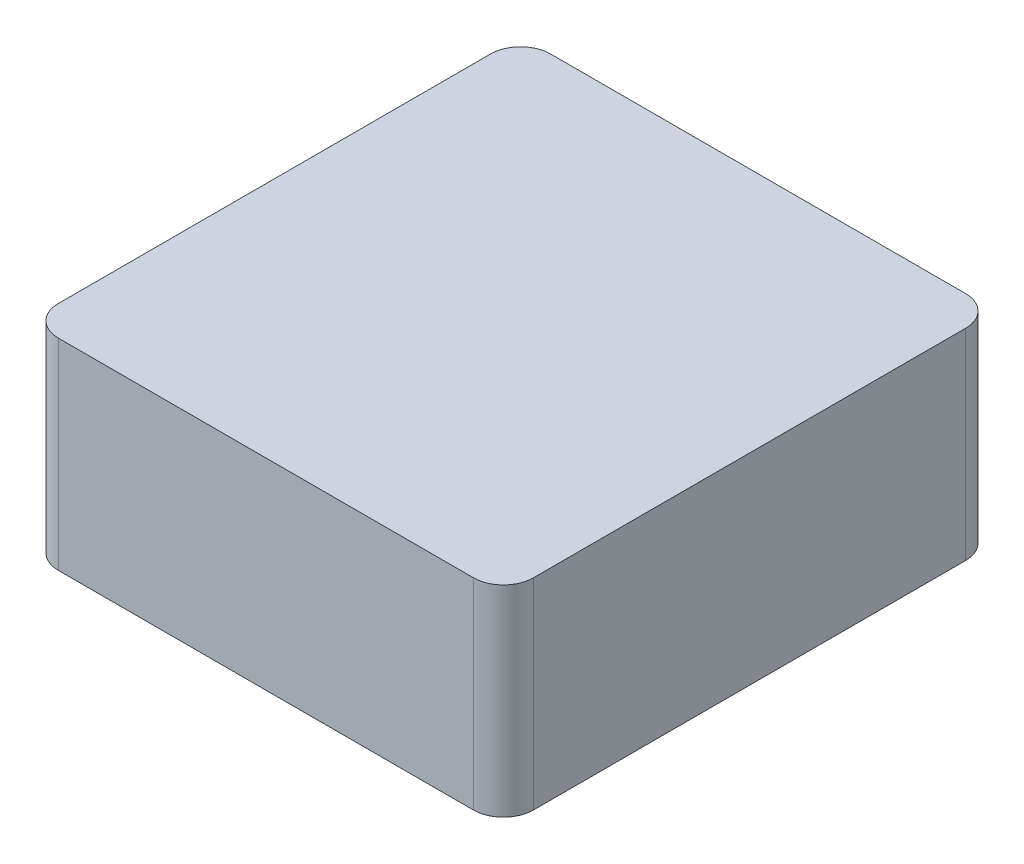
ISO-10303-21;
HEADER;
FILE_DESCRIPTION(('STEP AP214'),'2;1');
FILE_NAME('part.step','',(''),(''),'','','');
FILE_SCHEMA(('AUTOMOTIVE_DESIGN { 1 0 10303 214 1 1 1 1 }'));
ENDSEC;
DATA;
#1=APPLICATION_CONTEXT('core data for automotive mechanical design processes');
#2=APPLICATION_PROTOCOL_DEFINITION('international standard','automotive_design',2000,#1);
#3=PRODUCT_CONTEXT('',#1,'mechanical');
#4=PRODUCT('Part','Part','',(#3));
#5=PRODUCT_RELATED_PRODUCT_CATEGORY('part','',(#4));
#6=PRODUCT_DEFINITION_FORMATION('','',#4);
#7=PRODUCT_DEFINITION_CONTEXT('part definition',#1,'design');
#8=PRODUCT_DEFINITION('design','',#6,#7);
#9=PRODUCT_DEFINITION_SHAPE('','',#8);
#10=(LENGTH_UNIT() NAMED_UNIT(*) SI_UNIT(.MILLI.,.METRE.));
#11=(NAMED_UNIT(*) PLANE_ANGLE_UNIT() SI_UNIT($,.RADIAN.));
#12=(NAMED_UNIT(*) SI_UNIT($,.STERADIAN.) SOLID_ANGLE_UNIT());
#13=UNCERTAINTY_MEASURE_WITH_UNIT(LENGTH_MEASURE(1.E-05),#10,'distance_accuracy_value','');
#14=(GEOMETRIC_REPRESENTATION_CONTEXT(3) GLOBAL_UNCERTAINTY_ASSIGNED_CONTEXT((#13)) GLOBAL_UNIT_ASSIGNED_CONTEXT((#10,
#11,#12)) REPRESENTATION_CONTEXT('',''));
#15=CARTESIAN_POINT('',(0.,0.,0.));
#16=DIRECTION('',(0.,0.,1.));
#17=DIRECTION('',(1.,0.,0.));
#18=AXIS2_PLACEMENT_3D('',#15,#16,#17);
#19=CARTESIAN_POINT('',(48.5,23.5,50.5));
#20=DIRECTION('',(0.,-1.,0.));
#21=DIRECTION('',(0.,0.,-1.));
#22=AXIS2_PLACEMENT_3D('',#19,#20,#21);
#23=CYLINDRICAL_SURFACE('',#22,7.00000000000001);
#24=CARTESIAN_POINT('',(48.5,-23.5,50.5));
#25=DIRECTION('',(0.,1.,0.));
#26=DIRECTION('',(0.,0.,1.));
#27=AXIS2_PLACEMENT_3D('',#24,#25,#26);
#28=CIRCLE('',#27,7.00000000000001);
#29=CARTESIAN_POINT('',(48.5,-23.5,57.5));
#30=VERTEX_POINT('',#29);
#31=CARTESIAN_POINT('',(55.5,-23.5,50.5));
#32=VERTEX_POINT('',#31);
#33=EDGE_CURVE('E143',#30,#32,#28,.T.);
#34=ORIENTED_EDGE('',*,*,#33,.T.);
#35=DIRECTION('',(0.,-1.,0.));
#36=VECTOR('',#35,1.);
#37=CARTESIAN_POINT('',(55.5,23.5,50.5));
#38=LINE('',#37,#36);
#39=CARTESIAN_POINT('',(55.5,23.5,50.5));
#40=VERTEX_POINT('',#39);
#41=EDGE_CURVE('E171',#40,#32,#38,.T.);
#42=ORIENTED_EDGE('',*,*,#41,.F.);
#43=CARTESIAN_POINT('',(48.5,23.5,50.5));
#44=DIRECTION('',(0.,1.,0.));
#45=DIRECTION('',(0.,0.,1.));
#46=AXIS2_PLACEMENT_3D('',#43,#44,#45);
#47=CIRCLE('',#46,7.00000000000001);
#48=CARTESIAN_POINT('',(48.5,23.5,57.5));
#49=VERTEX_POINT('',#48);
#50=EDGE_CURVE('E158',#49,#40,#47,.T.);
#51=ORIENTED_EDGE('',*,*,#50,.F.);
#52=DIRECTION('',(0.,-1.,0.));
#53=VECTOR('',#52,1.);
#54=CARTESIAN_POINT('',(48.5,23.5,57.5));
#55=LINE('',#54,#53);
#56=EDGE_CURVE('E139',#49,#30,#55,.T.);
#57=ORIENTED_EDGE('',*,*,#56,.T.);
#58=EDGE_LOOP('',(#34,#42,#51,#57));
#59=FACE_BOUND('',#58,.T.);
#60=ADVANCED_FACE('F43',(#59),#23,.T.);
#61=CARTESIAN_POINT('',(55.5,23.5,-50.5));
#62=DIRECTION('',(-1.,0.,0.));
#63=DIRECTION('',(0.,0.,1.));
#64=AXIS2_PLACEMENT_3D('',#61,#62,#63);
#65=PLANE('',#64);
#66=DIRECTION('',(0.,0.,-1.));
#67=VECTOR('',#66,1.);
#68=CARTESIAN_POINT('',(55.5,-23.5,-50.5));
#69=LINE('',#68,#67);
#70=CARTESIAN_POINT('',(55.5,-23.5,-50.5));
#71=VERTEX_POINT('',#70);
#72=EDGE_CURVE('E146',#32,#71,#69,.T.);
#73=ORIENTED_EDGE('',*,*,#72,.T.);
#74=DIRECTION('',(0.,-1.,0.));
#75=VECTOR('',#74,1.);
#76=CARTESIAN_POINT('',(55.5,23.5,-50.5));
#77=LINE('',#76,#75);
#78=CARTESIAN_POINT('',(55.5,23.5,-50.5));
#79=VERTEX_POINT('',#78);
#80=EDGE_CURVE('E168',#79,#71,#77,.T.);
#81=ORIENTED_EDGE('',*,*,#80,.F.);
#82=DIRECTION('',(0.,0.,-1.));
#83=VECTOR('',#82,1.);
#84=CARTESIAN_POINT('',(55.5,23.5,-50.5));
#85=LINE('',#84,#83);
#86=EDGE_CURVE('E104',#40,#79,#85,.T.);
#87=ORIENTED_EDGE('',*,*,#86,.F.);
#88=ORIENTED_EDGE('',*,*,#41,.T.);
#89=EDGE_LOOP('',(#73,#81,#87,#88));
#90=FACE_BOUND('',#89,.T.);
#91=ADVANCED_FACE('F208',(#90),#65,.F.);
#92=CARTESIAN_POINT('',(48.5,23.5,-50.5));
#93=DIRECTION('',(0.,-1.,0.));
#94=DIRECTION('',(0.,0.,-1.));
#95=AXIS2_PLACEMENT_3D('',#92,#93,#94);
#96=CYLINDRICAL_SURFACE('',#95,7.);
#97=CARTESIAN_POINT('',(48.5,-23.5,-50.5));
#98=DIRECTION('',(0.,1.,0.));
#99=DIRECTION('',(0.,0.,-1.));
#100=AXIS2_PLACEMENT_3D('',#97,#98,#99);
#101=CIRCLE('',#100,7.);
#102=CARTESIAN_POINT('',(48.5,-23.5,-57.5));
#103=VERTEX_POINT('',#102);
#104=EDGE_CURVE('E149',#71,#103,#101,.T.);
#105=ORIENTED_EDGE('',*,*,#104,.T.);
#106=DIRECTION('',(0.,-1.,0.));
#107=VECTOR('',#106,1.);
#108=CARTESIAN_POINT('',(48.5,23.5,-57.5));
#109=LINE('',#108,#107);
#110=CARTESIAN_POINT('',(48.5,23.5,-57.5));
#111=VERTEX_POINT('',#110);
#112=EDGE_CURVE('E165',#111,#103,#109,.T.);
#113=ORIENTED_EDGE('',*,*,#112,.F.);
#114=CARTESIAN_POINT('',(48.5,23.5,-50.5));
#115=DIRECTION('',(0.,1.,0.));
#116=DIRECTION('',(0.,0.,-1.));
#117=AXIS2_PLACEMENT_3D('',#114,#115,#116);
#118=CIRCLE('',#117,7.);
#119=EDGE_CURVE('E420',#79,#111,#118,.T.);
#120=ORIENTED_EDGE('',*,*,#119,.F.);
#121=ORIENTED_EDGE('',*,*,#80,.T.);
#122=EDGE_LOOP('',(#105,#113,#120,#121));
#123=FACE_BOUND('',#122,.T.);
#124=ADVANCED_FACE('F212',(#123),#96,.T.);
#125=CARTESIAN_POINT('',(-48.5,23.5,-57.5));
#126=DIRECTION('',(0.,0.,1.));
#127=DIRECTION('',(1.,0.,0.));
#128=AXIS2_PLACEMENT_3D('',#125,#126,#127);
#129=PLANE('',#128);
#130=DIRECTION('',(-1.,0.,0.));
#131=VECTOR('',#130,1.);
#132=CARTESIAN_POINT('',(-48.5,-23.5,-57.5));
#133=LINE('',#132,#131);
#134=CARTESIAN_POINT('',(-48.5,-23.5,-57.5));
#135=VERTEX_POINT('',#134);
#136=EDGE_CURVE('E151',#103,#135,#133,.T.);
#137=ORIENTED_EDGE('',*,*,#136,.T.);
#138=DIRECTION('',(0.,-1.,0.));
#139=VECTOR('',#138,1.);
#140=CARTESIAN_POINT('',(-48.5,23.5,-57.5));
#141=LINE('',#140,#139);
#142=CARTESIAN_POINT('',(-48.5,23.5,-57.5));
#143=VERTEX_POINT('',#142);
#144=EDGE_CURVE('E162',#143,#135,#141,.T.);
#145=ORIENTED_EDGE('',*,*,#144,.F.);
#146=DIRECTION('',(-1.,0.,0.));
#147=VECTOR('',#146,1.);
#148=CARTESIAN_POINT('',(-48.5,23.5,-57.5));
#149=LINE('',#148,#147);
#150=EDGE_CURVE('E422',#111,#143,#149,.T.);
#151=ORIENTED_EDGE('',*,*,#150,.F.);
#152=ORIENTED_EDGE('',*,*,#112,.T.);
#153=EDGE_LOOP('',(#137,#145,#151,#152));
#154=FACE_BOUND('',#153,.T.);
#155=ADVANCED_FACE('F216',(#154),#129,.F.);
#156=CARTESIAN_POINT('',(-48.5,23.5,-50.5));
#157=DIRECTION('',(0.,-1.,0.));
#158=DIRECTION('',(0.,0.,-1.));
#159=AXIS2_PLACEMENT_3D('',#156,#157,#158);
#160=CYLINDRICAL_SURFACE('',#159,7.);
#161=CARTESIAN_POINT('',(-48.5,-23.5,-50.5));
#162=DIRECTION('',(0.,1.,0.));
#163=DIRECTION('',(0.,0.,1.));
#164=AXIS2_PLACEMENT_3D('',#161,#162,#163);
#165=CIRCLE('',#164,7.);
#166=CARTESIAN_POINT('',(-55.5,-23.5,-50.5));
#167=VERTEX_POINT('',#166);
#168=EDGE_CURVE('E153',#135,#167,#165,.T.);
#169=ORIENTED_EDGE('',*,*,#168,.T.);
#170=DIRECTION('',(0.,-1.,0.));
#171=VECTOR('',#170,1.);
#172=CARTESIAN_POINT('',(-55.5,23.5,-50.5));
#173=LINE('',#172,#171);
#174=CARTESIAN_POINT('',(-55.5,23.5,-50.5));
#175=VERTEX_POINT('',#174);
#176=EDGE_CURVE('E134',#175,#167,#173,.T.);
#177=ORIENTED_EDGE('',*,*,#176,.F.);
#178=CARTESIAN_POINT('',(-48.5,23.5,-50.5));
#179=DIRECTION('',(0.,1.,0.));
#180=DIRECTION('',(0.,0.,1.));
#181=AXIS2_PLACEMENT_3D('',#178,#179,#180);
#182=CIRCLE('',#181,7.);
#183=EDGE_CURVE('E125',#143,#175,#182,.T.);
#184=ORIENTED_EDGE('',*,*,#183,.F.);
#185=ORIENTED_EDGE('',*,*,#144,.T.);
#186=EDGE_LOOP('',(#169,#177,#184,#185));
#187=FACE_BOUND('',#186,.T.);
#188=ADVANCED_FACE('F222',(#187),#160,.T.);
#189=CARTESIAN_POINT('',(-55.5,23.5,-50.5));
#190=DIRECTION('',(1.,0.,0.));
#191=DIRECTION('',(0.,0.,-1.));
#192=AXIS2_PLACEMENT_3D('',#189,#190,#191);
#193=PLANE('',#192);
#194=DIRECTION('',(0.,0.,1.));
#195=VECTOR('',#194,1.);
#196=CARTESIAN_POINT('',(-55.5,-23.5,-50.5));
#197=LINE('',#196,#195);
#198=CARTESIAN_POINT('',(-55.5,-23.5,50.5));
#199=VERTEX_POINT('',#198);
#200=EDGE_CURVE('E133',#167,#199,#197,.T.);
#201=ORIENTED_EDGE('',*,*,#200,.T.);
#202=DIRECTION('',(0.,-1.,0.));
#203=VECTOR('',#202,1.);
#204=CARTESIAN_POINT('',(-55.5,23.5,50.5));
#205=LINE('',#204,#203);
#206=CARTESIAN_POINT('',(-55.5,23.5,50.5));
#207=VERTEX_POINT('',#206);
#208=EDGE_CURVE('E130',#207,#199,#205,.T.);
#209=ORIENTED_EDGE('',*,*,#208,.F.);
#210=DIRECTION('',(0.,0.,1.));
#211=VECTOR('',#210,1.);
#212=CARTESIAN_POINT('',(-55.5,23.5,-50.5));
#213=LINE('',#212,#211);
#214=EDGE_CURVE('E119',#175,#207,#213,.T.);
#215=ORIENTED_EDGE('',*,*,#214,.F.);
#216=ORIENTED_EDGE('',*,*,#176,.T.);
#217=EDGE_LOOP('',(#201,#209,#215,#216));
#218=FACE_BOUND('',#217,.T.);
#219=ADVANCED_FACE('F131',(#218),#193,.F.);
#220=CARTESIAN_POINT('',(-48.5,23.5,50.5));
#221=DIRECTION('',(0.,-1.,0.));
#222=DIRECTION('',(0.,0.,-1.));
#223=AXIS2_PLACEMENT_3D('',#220,#221,#222);
#224=CYLINDRICAL_SURFACE('',#223,7.);
#225=CARTESIAN_POINT('',(-48.5,-23.5,50.5));
#226=DIRECTION('',(0.,1.,0.));
#227=DIRECTION('',(0.,0.,1.));
#228=AXIS2_PLACEMENT_3D('',#225,#226,#227);
#229=CIRCLE('',#228,7.);
#230=CARTESIAN_POINT('',(-48.5,-23.5,57.5));
#231=VERTEX_POINT('',#230);
#232=EDGE_CURVE('E89',#199,#231,#229,.T.);
#233=ORIENTED_EDGE('',*,*,#232,.T.);
#234=DIRECTION('',(0.,-1.,0.));
#235=VECTOR('',#234,1.);
#236=CARTESIAN_POINT('',(-48.5,23.5,57.5));
#237=LINE('',#236,#235);
#238=CARTESIAN_POINT('',(-48.5,23.5,57.5));
#239=VERTEX_POINT('',#238);
#240=EDGE_CURVE('E135',#239,#231,#237,.T.);
#241=ORIENTED_EDGE('',*,*,#240,.F.);
#242=CARTESIAN_POINT('',(-48.5,23.5,50.5));
#243=DIRECTION('',(0.,1.,0.));
#244=DIRECTION('',(0.,0.,1.));
#245=AXIS2_PLACEMENT_3D('',#242,#243,#244);
#246=CIRCLE('',#245,7.);
#247=EDGE_CURVE('E123',#207,#239,#246,.T.);
#248=ORIENTED_EDGE('',*,*,#247,.F.);
#249=ORIENTED_EDGE('',*,*,#208,.T.);
#250=EDGE_LOOP('',(#233,#241,#248,#249));
#251=FACE_BOUND('',#250,.T.);
#252=ADVANCED_FACE('F137',(#251),#224,.T.);
#253=CARTESIAN_POINT('',(-48.5,23.5,57.5));
#254=DIRECTION('',(0.,0.,-1.));
#255=DIRECTION('',(-1.,0.,0.));
#256=AXIS2_PLACEMENT_3D('',#253,#254,#255);
#257=PLANE('',#256);
#258=DIRECTION('',(1.,0.,0.));
#259=VECTOR('',#258,1.);
#260=CARTESIAN_POINT('',(-48.5,-23.5,57.5));
#261=LINE('',#260,#259);
#262=EDGE_CURVE('E95',#231,#30,#261,.T.);
#263=ORIENTED_EDGE('',*,*,#262,.T.);
#264=ORIENTED_EDGE('',*,*,#56,.F.);
#265=DIRECTION('',(1.,0.,0.));
#266=VECTOR('',#265,1.);
#267=CARTESIAN_POINT('',(-48.5,23.5,57.5));
#268=LINE('',#267,#266);
#269=EDGE_CURVE('E59',#239,#49,#268,.T.);
#270=ORIENTED_EDGE('',*,*,#269,.F.);
#271=ORIENTED_EDGE('',*,*,#240,.T.);
#272=EDGE_LOOP('',(#263,#264,#270,#271));
#273=FACE_BOUND('',#272,.T.);
#274=ADVANCED_FACE('F198',(#273),#257,.F.);
#275=CARTESIAN_POINT('',(48.5,23.5,50.5));
#276=DIRECTION('',(0.,1.,0.));
#277=DIRECTION('',(0.,0.,1.));
#278=AXIS2_PLACEMENT_3D('',#275,#276,#277);
#279=PLANE('',#278);
#280=ORIENTED_EDGE('',*,*,#50,.T.);
#281=ORIENTED_EDGE('',*,*,#86,.T.);
#282=ORIENTED_EDGE('',*,*,#119,.T.);
#283=ORIENTED_EDGE('',*,*,#150,.T.);
#284=ORIENTED_EDGE('',*,*,#183,.T.);
#285=ORIENTED_EDGE('',*,*,#214,.T.);
#286=ORIENTED_EDGE('',*,*,#247,.T.);
#287=ORIENTED_EDGE('',*,*,#269,.T.);
#288=EDGE_LOOP('',(#280,#281,#282,#283,#284,#285,#286,#287));
#289=FACE_BOUND('',#288,.T.);
#290=ADVANCED_FACE('F121',(#289),#279,.T.);
#291=CARTESIAN_POINT('',(48.5,-23.5,50.5));
#292=DIRECTION('',(0.,1.,0.));
#293=DIRECTION('',(0.,0.,1.));
#294=AXIS2_PLACEMENT_3D('',#291,#292,#293);
#295=PLANE('',#294);
#296=CARTESIAN_POINT('',(42.5,-23.5,0.));
#297=DIRECTION('',(0.,-1.,0.));
#298=DIRECTION('',(0.,0.,-1.));
#299=AXIS2_PLACEMENT_3D('',#296,#297,#298);
#300=CIRCLE('',#299,1.24999999999999);
#301=CARTESIAN_POINT('',(42.5,-23.5,-1.24999999999999));
#302=VERTEX_POINT('',#301);
#303=EDGE_CURVE('E397',#302,#302,#300,.T.);
#304=ORIENTED_EDGE('',*,*,#303,.F.);
#305=EDGE_LOOP('',(#304));
#306=FACE_BOUND('',#305,.T.);
#307=CARTESIAN_POINT('',(-42.5,-23.5,0.));
#308=DIRECTION('',(0.,-1.,0.));
#309=DIRECTION('',(0.,0.,-1.));
#310=AXIS2_PLACEMENT_3D('',#307,#308,#309);
#311=CIRCLE('',#310,1.24999999999999);
#312=CARTESIAN_POINT('',(-42.5,-23.5,-1.25));
#313=VERTEX_POINT('',#312);
#314=EDGE_CURVE('E399',#313,#313,#311,.T.);
#315=ORIENTED_EDGE('',*,*,#314,.F.);
#316=EDGE_LOOP('',(#315));
#317=FACE_BOUND('',#316,.T.);
#318=CARTESIAN_POINT('',(45.,-23.5,-47.5));
#319=DIRECTION('',(0.,1.,0.));
#320=DIRECTION('',(0.,0.,1.));
#321=AXIS2_PLACEMENT_3D('',#318,#319,#320);
#322=CIRCLE('',#321,6.00000000000001);
#323=CARTESIAN_POINT('',(45.,-23.5,-41.5));
#324=VERTEX_POINT('',#323);
#325=EDGE_CURVE('E11',#324,#324,#322,.F.);
#326=ORIENTED_EDGE('',*,*,#325,.F.);
#327=EDGE_LOOP('',(#326));
#328=FACE_BOUND('',#327,.T.);
#329=CARTESIAN_POINT('',(-45.,-23.5,-47.5));
#330=DIRECTION('',(0.,1.,0.));
#331=DIRECTION('',(0.,0.,1.));
#332=AXIS2_PLACEMENT_3D('',#329,#330,#331);
#333=CIRCLE('',#332,6.00000000000001);
#334=CARTESIAN_POINT('',(-45.,-23.5,-41.5));
#335=VERTEX_POINT('',#334);
#336=EDGE_CURVE('E51',#335,#335,#333,.F.);
#337=ORIENTED_EDGE('',*,*,#336,.F.);
#338=EDGE_LOOP('',(#337));
#339=FACE_BOUND('',#338,.T.);
#340=CARTESIAN_POINT('',(-45.,-23.5,47.5));
#341=DIRECTION('',(0.,1.,0.));
#342=DIRECTION('',(0.,0.,1.));
#343=AXIS2_PLACEMENT_3D('',#340,#341,#342);
#344=CIRCLE('',#343,6.);
#345=CARTESIAN_POINT('',(-45.,-23.5,53.5));
#346=VERTEX_POINT('',#345);
#347=EDGE_CURVE('E176',#346,#346,#344,.F.);
#348=ORIENTED_EDGE('',*,*,#347,.F.);
#349=EDGE_LOOP('',(#348));
#350=FACE_BOUND('',#349,.T.);
#351=CARTESIAN_POINT('',(45.,-23.5,47.5));
#352=DIRECTION('',(0.,1.,0.));
#353=DIRECTION('',(0.,0.,1.));
#354=AXIS2_PLACEMENT_3D('',#351,#352,#353);
#355=CIRCLE('',#354,6.);
#356=CARTESIAN_POINT('',(45.,-23.5,53.5));
#357=VERTEX_POINT('',#356);
#358=EDGE_CURVE('E173',#357,#357,#355,.F.);
#359=ORIENTED_EDGE('',*,*,#358,.F.);
#360=EDGE_LOOP('',(#359));
#361=FACE_BOUND('',#360,.T.);
#362=ORIENTED_EDGE('',*,*,#33,.F.);
#363=ORIENTED_EDGE('',*,*,#262,.F.);
#364=ORIENTED_EDGE('',*,*,#232,.F.);
#365=ORIENTED_EDGE('',*,*,#200,.F.);
#366=ORIENTED_EDGE('',*,*,#168,.F.);
#367=ORIENTED_EDGE('',*,*,#136,.F.);
#368=ORIENTED_EDGE('',*,*,#104,.F.);
#369=ORIENTED_EDGE('',*,*,#72,.F.);
#370=EDGE_LOOP('',(#362,#363,#364,#365,#366,#367,#368,#369));
#371=FACE_BOUND('',#370,.T.);
#372=ADVANCED_FACE('F183',(#306,#317,#328,#339,#350,#361,#371),#295,.F.);
#373=CARTESIAN_POINT('',(45.,-26.75,47.5));
#374=DIRECTION('',(0.,1.,0.));
#375=DIRECTION('',(0.,0.,1.));
#376=AXIS2_PLACEMENT_3D('',#373,#374,#375);
#377=CYLINDRICAL_SURFACE('',#376,6.);
#378=CARTESIAN_POINT('',(45.,-26.75,47.5));
#379=DIRECTION('',(0.,-1.,0.));
#380=DIRECTION('',(0.,0.,-1.));
#381=AXIS2_PLACEMENT_3D('',#378,#379,#380);
#382=CIRCLE('',#381,6.);
#383=CARTESIAN_POINT('',(45.,-26.75,53.5));
#384=VERTEX_POINT('',#383);
#385=EDGE_CURVE('E147',#384,#384,#382,.T.);
#386=CARTESIAN_POINT('',(45.,-26.75,53.5));
#387=CARTESIAN_POINT('',(45.,-26.7161458333333,53.5));
#388=CARTESIAN_POINT('',(45.,-26.6822916666667,53.5));
#389=CARTESIAN_POINT('',(45.,-26.6145833333333,53.5));
#390=CARTESIAN_POINT('',(45.,-26.5807291666667,53.5));
#391=CARTESIAN_POINT('',(45.,-26.5130208333333,53.5));
#392=CARTESIAN_POINT('',(45.,-26.4791666666667,53.5));
#393=CARTESIAN_POINT('',(45.,-26.4114583333333,53.5));
#394=CARTESIAN_POINT('',(45.,-26.3776041666667,53.5));
#395=CARTESIAN_POINT('',(45.,-26.3098958333333,53.5));
#396=CARTESIAN_POINT('',(45.,-26.2760416666667,53.5));
#397=CARTESIAN_POINT('',(45.,-26.2083333333333,53.5));
#398=CARTESIAN_POINT('',(45.,-26.1744791666667,53.5));
#399=CARTESIAN_POINT('',(45.,-26.1067708333333,53.5));
#400=CARTESIAN_POINT('',(45.,-26.0729166666667,53.5));
#401=CARTESIAN_POINT('',(45.,-26.0052083333333,53.5));
#402=CARTESIAN_POINT('',(45.,-25.9713541666667,53.5));
#403=CARTESIAN_POINT('',(45.,-25.9036458333333,53.5));
#404=CARTESIAN_POINT('',(45.,-25.8697916666667,53.5));
#405=CARTESIAN_POINT('',(45.,-25.8020833333333,53.5));
#406=CARTESIAN_POINT('',(45.,-25.7682291666667,53.5));
#407=CARTESIAN_POINT('',(45.,-25.7005208333333,53.5));
#408=CARTESIAN_POINT('',(45.,-25.6666666666667,53.5));
#409=CARTESIAN_POINT('',(45.,-25.5989583333333,53.5));
#410=CARTESIAN_POINT('',(45.,-25.5651041666667,53.5));
#411=CARTESIAN_POINT('',(45.,-25.4973958333333,53.5));
#412=CARTESIAN_POINT('',(45.,-25.4635416666667,53.5));
#413=CARTESIAN_POINT('',(45.,-25.3958333333333,53.5));
#414=CARTESIAN_POINT('',(45.,-25.3619791666667,53.5));
#415=CARTESIAN_POINT('',(45.,-25.2942708333333,53.5));
#416=CARTESIAN_POINT('',(45.,-25.2604166666667,53.5));
#417=CARTESIAN_POINT('',(45.,-25.1927083333333,53.5));
#418=CARTESIAN_POINT('',(45.,-25.1588541666667,53.5));
#419=CARTESIAN_POINT('',(45.,-25.0911458333333,53.5));
#420=CARTESIAN_POINT('',(45.,-25.0572916666667,53.5));
#421=CARTESIAN_POINT('',(45.,-24.9895833333333,53.5));
#422=CARTESIAN_POINT('',(45.,-24.9557291666667,53.5));
#423=CARTESIAN_POINT('',(45.,-24.8880208333333,53.5));
#424=CARTESIAN_POINT('',(45.,-24.8541666666667,53.5));
#425=CARTESIAN_POINT('',(45.,-24.7864583333333,53.5));
#426=CARTESIAN_POINT('',(45.,-24.7526041666667,53.5));
#427=CARTESIAN_POINT('',(45.,-24.6848958333333,53.5));
#428=CARTESIAN_POINT('',(45.,-24.6510416666667,53.5));
#429=CARTESIAN_POINT('',(45.,-24.5833333333333,53.5));
#430=CARTESIAN_POINT('',(45.,-24.5494791666667,53.5));
#431=CARTESIAN_POINT('',(45.,-24.4817708333333,53.5));
#432=CARTESIAN_POINT('',(45.,-24.4479166666667,53.5));
#433=CARTESIAN_POINT('',(45.,-24.3802083333333,53.5));
#434=CARTESIAN_POINT('',(45.,-24.3463541666667,53.5));
#435=CARTESIAN_POINT('',(45.,-24.2786458333333,53.5));
#436=CARTESIAN_POINT('',(45.,-24.2447916666667,53.5));
#437=CARTESIAN_POINT('',(45.,-24.1770833333333,53.5));
#438=CARTESIAN_POINT('',(45.,-24.1432291666667,53.5));
#439=CARTESIAN_POINT('',(45.,-24.0755208333333,53.5));
#440=CARTESIAN_POINT('',(45.,-24.0416666666667,53.5));
#441=CARTESIAN_POINT('',(45.,-23.9739583333333,53.5));
#442=CARTESIAN_POINT('',(45.,-23.9401041666667,53.5));
#443=CARTESIAN_POINT('',(45.,-23.8723958333333,53.5));
#444=CARTESIAN_POINT('',(45.,-23.8385416666667,53.5));
#445=CARTESIAN_POINT('',(45.,-23.7708333333333,53.5));
#446=CARTESIAN_POINT('',(45.,-23.7369791666667,53.5));
#447=CARTESIAN_POINT('',(45.,-23.6692708333333,53.5));
#448=CARTESIAN_POINT('',(45.,-23.6354166666667,53.5));
#449=CARTESIAN_POINT('',(45.,-23.5677083333333,53.5));
#450=CARTESIAN_POINT('',(45.,-23.5338541666667,53.5));
#451=CARTESIAN_POINT('',(45.,-23.5,53.5));
#452=B_SPLINE_CURVE_WITH_KNOTS('',3,(#386,#387,#388,#389,#390,#391,#392,#393,#394,#395,#396,
#397,#398,#399,#400,#401,#402,#403,#404,#405,#406,#407,#408,#409,#410,#411,#412,#413,#414,#415,
#416,#417,#418,#419,#420,#421,#422,#423,#424,#425,#426,#427,#428,#429,#430,#431,#432,#433,#434,
#435,#436,#437,#438,#439,#440,#441,#442,#443,#444,#445,#446,#447,#448,#449,#450,#451),
.UNSPECIFIED.,.F.,.F.,(4,2,2,2,2,2,2,2,2,2,2,2,2,2,2,2,2,2,2,2,2,2,2,2,2,2,2,2,2,2,2,2,4),(0.,
0.101562500000003,0.203125000000002,0.304687500000001,0.40625,0.5078125,0.609375000000002,
0.710937500000002,0.812500000000001,0.9140625,1.015625,1.1171875,1.21875,1.3203125,1.421875,
1.5234375,1.625,1.7265625,1.828125,1.9296875,2.03125,2.1328125,2.234375,2.3359375,2.4375,
2.5390625,2.640625,2.7421875,2.84375,2.9453125,3.046875,3.1484375,3.25),.UNSPECIFIED.);
#453=EDGE_CURVE('BSEAM186',#384,#357,#452,.T.);
#454=ORIENTED_EDGE('',*,*,#385,.F.);
#455=ORIENTED_EDGE('',*,*,#358,.T.);
#456=ORIENTED_EDGE('',*,*,#453,.T.);
#457=ORIENTED_EDGE('',*,*,#453,.F.);
#458=EDGE_LOOP('',(#454,#456,#455,#457));
#459=FACE_BOUND('',#458,.T.);
#460=ADVANCED_FACE('F186',(#459),#377,.T.);
#461=CARTESIAN_POINT('',(45.,-26.75,47.5));
#462=DIRECTION('',(0.,-1.,0.));
#463=DIRECTION('',(0.,0.,-1.));
#464=AXIS2_PLACEMENT_3D('',#461,#462,#463);
#465=PLANE('',#464);
#466=ORIENTED_EDGE('',*,*,#385,.T.);
#467=EDGE_LOOP('',(#466));
#468=FACE_BOUND('',#467,.T.);
#469=ADVANCED_FACE('F267',(#468),#465,.T.);
#470=CARTESIAN_POINT('',(-45.,-26.75,47.5));
#471=DIRECTION('',(0.,1.,0.));
#472=DIRECTION('',(0.,0.,1.));
#473=AXIS2_PLACEMENT_3D('',#470,#471,#472);
#474=CYLINDRICAL_SURFACE('',#473,6.);
#475=CARTESIAN_POINT('',(-45.,-26.75,47.5));
#476=DIRECTION('',(0.,-1.,0.));
#477=DIRECTION('',(0.,0.,-1.));
#478=AXIS2_PLACEMENT_3D('',#475,#476,#477);
#479=CIRCLE('',#478,6.);
#480=CARTESIAN_POINT('',(-45.,-26.75,53.5));
#481=VERTEX_POINT('',#480);
#482=EDGE_CURVE('E408',#481,#481,#479,.T.);
#483=CARTESIAN_POINT('',(-45.,-26.75,53.5));
#484=CARTESIAN_POINT('',(-45.,-26.7161458333333,53.5));
#485=CARTESIAN_POINT('',(-45.,-26.6822916666667,53.5));
#486=CARTESIAN_POINT('',(-45.,-26.6145833333333,53.5));
#487=CARTESIAN_POINT('',(-45.,-26.5807291666667,53.5));
#488=CARTESIAN_POINT('',(-45.,-26.5130208333333,53.5));
#489=CARTESIAN_POINT('',(-45.,-26.4791666666667,53.5));
#490=CARTESIAN_POINT('',(-45.,-26.4114583333333,53.5));
#491=CARTESIAN_POINT('',(-45.,-26.3776041666667,53.5));
#492=CARTESIAN_POINT('',(-45.,-26.3098958333333,53.5));
#493=CARTESIAN_POINT('',(-45.,-26.2760416666667,53.5));
#494=CARTESIAN_POINT('',(-45.,-26.2083333333333,53.5));
#495=CARTESIAN_POINT('',(-45.,-26.1744791666667,53.5));
#496=CARTESIAN_POINT('',(-45.,-26.1067708333333,53.5));
#497=CARTESIAN_POINT('',(-45.,-26.0729166666667,53.5));
#498=CARTESIAN_POINT('',(-45.,-26.0052083333333,53.5));
#499=CARTESIAN_POINT('',(-45.,-25.9713541666667,53.5));
#500=CARTESIAN_POINT('',(-45.,-25.9036458333333,53.5));
#501=CARTESIAN_POINT('',(-45.,-25.8697916666667,53.5));
#502=CARTESIAN_POINT('',(-45.,-25.8020833333333,53.5));
#503=CARTESIAN_POINT('',(-45.,-25.7682291666667,53.5));
#504=CARTESIAN_POINT('',(-45.,-25.7005208333333,53.5));
#505=CARTESIAN_POINT('',(-45.,-25.6666666666667,53.5));
#506=CARTESIAN_POINT('',(-45.,-25.5989583333333,53.5));
#507=CARTESIAN_POINT('',(-45.,-25.5651041666667,53.5));
#508=CARTESIAN_POINT('',(-45.,-25.4973958333333,53.5));
#509=CARTESIAN_POINT('',(-45.,-25.4635416666667,53.5));
#510=CARTESIAN_POINT('',(-45.,-25.3958333333333,53.5));
#511=CARTESIAN_POINT('',(-45.,-25.3619791666667,53.5));
#512=CARTESIAN_POINT('',(-45.,-25.2942708333333,53.5));
#513=CARTESIAN_POINT('',(-45.,-25.2604166666667,53.5));
#514=CARTESIAN_POINT('',(-45.,-25.1927083333333,53.5));
#515=CARTESIAN_POINT('',(-45.,-25.1588541666667,53.5));
#516=CARTESIAN_POINT('',(-45.,-25.0911458333333,53.5));
#517=CARTESIAN_POINT('',(-45.,-25.0572916666667,53.5));
#518=CARTESIAN_POINT('',(-45.,-24.9895833333333,53.5));
#519=CARTESIAN_POINT('',(-45.,-24.9557291666667,53.5));
#520=CARTESIAN_POINT('',(-45.,-24.8880208333333,53.5));
#521=CARTESIAN_POINT('',(-45.,-24.8541666666667,53.5));
#522=CARTESIAN_POINT('',(-45.,-24.7864583333333,53.5));
#523=CARTESIAN_POINT('',(-45.,-24.7526041666667,53.5));
#524=CARTESIAN_POINT('',(-45.,-24.6848958333333,53.5));
#525=CARTESIAN_POINT('',(-45.,-24.6510416666667,53.5));
#526=CARTESIAN_POINT('',(-45.,-24.5833333333333,53.5));
#527=CARTESIAN_POINT('',(-45.,-24.5494791666667,53.5));
#528=CARTESIAN_POINT('',(-45.,-24.4817708333333,53.5));
#529=CARTESIAN_POINT('',(-45.,-24.4479166666667,53.5));
#530=CARTESIAN_POINT('',(-45.,-24.3802083333333,53.5));
#531=CARTESIAN_POINT('',(-45.,-24.3463541666667,53.5));
#532=CARTESIAN_POINT('',(-45.,-24.2786458333333,53.5));
#533=CARTESIAN_POINT('',(-45.,-24.2447916666667,53.5));
#534=CARTESIAN_POINT('',(-45.,-24.1770833333333,53.5));
#535=CARTESIAN_POINT('',(-45.,-24.1432291666667,53.5));
#536=CARTESIAN_POINT('',(-45.,-24.0755208333333,53.5));
#537=CARTESIAN_POINT('',(-45.,-24.0416666666667,53.5));
#538=CARTESIAN_POINT('',(-45.,-23.9739583333333,53.5));
#539=CARTESIAN_POINT('',(-45.,-23.9401041666667,53.5));
#540=CARTESIAN_POINT('',(-45.,-23.8723958333333,53.5));
#541=CARTESIAN_POINT('',(-45.,-23.8385416666667,53.5));
#542=CARTESIAN_POINT('',(-45.,-23.7708333333333,53.5));
#543=CARTESIAN_POINT('',(-45.,-23.7369791666667,53.5));
#544=CARTESIAN_POINT('',(-45.,-23.6692708333333,53.5));
#545=CARTESIAN_POINT('',(-45.,-23.6354166666667,53.5));
#546=CARTESIAN_POINT('',(-45.,-23.5677083333333,53.5));
#547=CARTESIAN_POINT('',(-45.,-23.5338541666667,53.5));
#548=CARTESIAN_POINT('',(-45.,-23.5,53.5));
#549=B_SPLINE_CURVE_WITH_KNOTS('',3,(#483,#484,#485,#486,#487,#488,#489,#490,#491,#492,#493,
#494,#495,#496,#497,#498,#499,#500,#501,#502,#503,#504,#505,#506,#507,#508,#509,#510,#511,#512,
#513,#514,#515,#516,#517,#518,#519,#520,#521,#522,#523,#524,#525,#526,#527,#528,#529,#530,#531,
#532,#533,#534,#535,#536,#537,#538,#539,#540,#541,#542,#543,#544,#545,#546,#547,#548),
.UNSPECIFIED.,.F.,.F.,(4,2,2,2,2,2,2,2,2,2,2,2,2,2,2,2,2,2,2,2,2,2,2,2,2,2,2,2,2,2,2,2,4),(0.,
0.101562500000003,0.203125000000002,0.304687500000001,0.40625,0.5078125,0.609375000000002,
0.710937500000002,0.812500000000001,0.9140625,1.015625,1.1171875,1.21875,1.3203125,1.421875,
1.5234375,1.625,1.7265625,1.828125,1.9296875,2.03125,2.1328125,2.234375,2.3359375,2.4375,
2.5390625,2.640625,2.7421875,2.84375,2.9453125,3.046875,3.1484375,3.25),.UNSPECIFIED.);
#550=EDGE_CURVE('BSEAM277',#481,#346,#549,.T.);
#551=ORIENTED_EDGE('',*,*,#482,.F.);
#552=ORIENTED_EDGE('',*,*,#347,.T.);
#553=ORIENTED_EDGE('',*,*,#550,.T.);
#554=ORIENTED_EDGE('',*,*,#550,.F.);
#555=EDGE_LOOP('',(#551,#553,#552,#554));
#556=FACE_BOUND('',#555,.T.);
#557=ADVANCED_FACE('F277',(#556),#474,.T.);
#558=CARTESIAN_POINT('',(-45.,-26.75,47.5));
#559=DIRECTION('',(0.,-1.,0.));
#560=DIRECTION('',(0.,0.,-1.));
#561=AXIS2_PLACEMENT_3D('',#558,#559,#560);
#562=PLANE('',#561);
#563=ORIENTED_EDGE('',*,*,#482,.T.);
#564=EDGE_LOOP('',(#563));
#565=FACE_BOUND('',#564,.T.);
#566=ADVANCED_FACE('F287',(#565),#562,.T.);
#567=CARTESIAN_POINT('',(-45.,-26.75,-47.5));
#568=DIRECTION('',(0.,1.,0.));
#569=DIRECTION('',(0.,0.,1.));
#570=AXIS2_PLACEMENT_3D('',#567,#568,#569);
#571=CYLINDRICAL_SURFACE('',#570,6.00000000000001);
#572=CARTESIAN_POINT('',(-45.,-26.75,-47.5));
#573=DIRECTION('',(0.,-1.,0.));
#574=DIRECTION('',(0.,0.,-1.));
#575=AXIS2_PLACEMENT_3D('',#572,#573,#574);
#576=CIRCLE('',#575,6.00000000000001);
#577=CARTESIAN_POINT('',(-45.,-26.75,-41.5));
#578=VERTEX_POINT('',#577);
#579=EDGE_CURVE('E411',#578,#578,#576,.T.);
#580=CARTESIAN_POINT('',(-45.,-26.75,-41.5));
#581=CARTESIAN_POINT('',(-45.,-26.7161458333333,-41.5));
#582=CARTESIAN_POINT('',(-45.,-26.6822916666667,-41.5));
#583=CARTESIAN_POINT('',(-45.,-26.6145833333333,-41.5));
#584=CARTESIAN_POINT('',(-45.,-26.5807291666667,-41.5));
#585=CARTESIAN_POINT('',(-45.,-26.5130208333333,-41.5));
#586=CARTESIAN_POINT('',(-45.,-26.4791666666667,-41.5));
#587=CARTESIAN_POINT('',(-45.,-26.4114583333333,-41.5));
#588=CARTESIAN_POINT('',(-45.,-26.3776041666667,-41.5));
#589=CARTESIAN_POINT('',(-45.,-26.3098958333333,-41.5));
#590=CARTESIAN_POINT('',(-45.,-26.2760416666667,-41.5));
#591=CARTESIAN_POINT('',(-45.,-26.2083333333333,-41.5));
#592=CARTESIAN_POINT('',(-45.,-26.1744791666667,-41.5));
#593=CARTESIAN_POINT('',(-45.,-26.1067708333333,-41.5));
#594=CARTESIAN_POINT('',(-45.,-26.0729166666667,-41.5));
#595=CARTESIAN_POINT('',(-45.,-26.0052083333333,-41.5));
#596=CARTESIAN_POINT('',(-45.,-25.9713541666667,-41.5));
#597=CARTESIAN_POINT('',(-45.,-25.9036458333333,-41.5));
#598=CARTESIAN_POINT('',(-45.,-25.8697916666667,-41.5));
#599=CARTESIAN_POINT('',(-45.,-25.8020833333333,-41.5));
#600=CARTESIAN_POINT('',(-45.,-25.7682291666667,-41.5));
#601=CARTESIAN_POINT('',(-45.,-25.7005208333333,-41.5));
#602=CARTESIAN_POINT('',(-45.,-25.6666666666667,-41.5));
#603=CARTESIAN_POINT('',(-45.,-25.5989583333333,-41.5));
#604=CARTESIAN_POINT('',(-45.,-25.5651041666667,-41.5));
#605=CARTESIAN_POINT('',(-45.,-25.4973958333333,-41.5));
#606=CARTESIAN_POINT('',(-45.,-25.4635416666667,-41.5));
#607=CARTESIAN_POINT('',(-45.,-25.3958333333333,-41.5));
#608=CARTESIAN_POINT('',(-45.,-25.3619791666667,-41.5));
#609=CARTESIAN_POINT('',(-45.,-25.2942708333333,-41.5));
#610=CARTESIAN_POINT('',(-45.,-25.2604166666667,-41.5));
#611=CARTESIAN_POINT('',(-45.,-25.1927083333333,-41.5));
#612=CARTESIAN_POINT('',(-45.,-25.1588541666667,-41.5));
#613=CARTESIAN_POINT('',(-45.,-25.0911458333333,-41.5));
#614=CARTESIAN_POINT('',(-45.,-25.0572916666667,-41.5));
#615=CARTESIAN_POINT('',(-45.,-24.9895833333333,-41.5));
#616=CARTESIAN_POINT('',(-45.,-24.9557291666667,-41.5));
#617=CARTESIAN_POINT('',(-45.,-24.8880208333333,-41.5));
#618=CARTESIAN_POINT('',(-45.,-24.8541666666667,-41.5));
#619=CARTESIAN_POINT('',(-45.,-24.7864583333333,-41.5));
#620=CARTESIAN_POINT('',(-45.,-24.7526041666667,-41.5));
#621=CARTESIAN_POINT('',(-45.,-24.6848958333333,-41.5));
#622=CARTESIAN_POINT('',(-45.,-24.6510416666667,-41.5));
#623=CARTESIAN_POINT('',(-45.,-24.5833333333333,-41.5));
#624=CARTESIAN_POINT('',(-45.,-24.5494791666667,-41.5));
#625=CARTESIAN_POINT('',(-45.,-24.4817708333333,-41.5));
#626=CARTESIAN_POINT('',(-45.,-24.4479166666667,-41.5));
#627=CARTESIAN_POINT('',(-45.,-24.3802083333333,-41.5));
#628=CARTESIAN_POINT('',(-45.,-24.3463541666667,-41.5));
#629=CARTESIAN_POINT('',(-45.,-24.2786458333333,-41.5));
#630=CARTESIAN_POINT('',(-45.,-24.2447916666667,-41.5));
#631=CARTESIAN_POINT('',(-45.,-24.1770833333333,-41.5));
#632=CARTESIAN_POINT('',(-45.,-24.1432291666667,-41.5));
#633=CARTESIAN_POINT('',(-45.,-24.0755208333333,-41.5));
#634=CARTESIAN_POINT('',(-45.,-24.0416666666667,-41.5));
#635=CARTESIAN_POINT('',(-45.,-23.9739583333333,-41.5));
#636=CARTESIAN_POINT('',(-45.,-23.9401041666667,-41.5));
#637=CARTESIAN_POINT('',(-45.,-23.8723958333333,-41.5));
#638=CARTESIAN_POINT('',(-45.,-23.8385416666667,-41.5));
#639=CARTESIAN_POINT('',(-45.,-23.7708333333333,-41.5));
#640=CARTESIAN_POINT('',(-45.,-23.7369791666667,-41.5));
#641=CARTESIAN_POINT('',(-45.,-23.6692708333333,-41.5));
#642=CARTESIAN_POINT('',(-45.,-23.6354166666667,-41.5));
#643=CARTESIAN_POINT('',(-45.,-23.5677083333333,-41.5));
#644=CARTESIAN_POINT('',(-45.,-23.5338541666667,-41.5));
#645=CARTESIAN_POINT('',(-45.,-23.5,-41.5));
#646=B_SPLINE_CURVE_WITH_KNOTS('',3,(#580,#581,#582,#583,#584,#585,#586,#587,#588,#589,#590,
#591,#592,#593,#594,#595,#596,#597,#598,#599,#600,#601,#602,#603,#604,#605,#606,#607,#608,#609,
#610,#611,#612,#613,#614,#615,#616,#617,#618,#619,#620,#621,#622,#623,#624,#625,#626,#627,#628,
#629,#630,#631,#632,#633,#634,#635,#636,#637,#638,#639,#640,#641,#642,#643,#644,#645),
.UNSPECIFIED.,.F.,.F.,(4,2,2,2,2,2,2,2,2,2,2,2,2,2,2,2,2,2,2,2,2,2,2,2,2,2,2,2,2,2,2,2,4),(0.,
0.101562500000003,0.203125000000002,0.304687500000001,0.40625,0.5078125,0.609375000000002,
0.710937500000002,0.812500000000001,0.9140625,1.015625,1.1171875,1.21875,1.3203125,1.421875,
1.5234375,1.625,1.7265625,1.828125,1.9296875,2.03125,2.1328125,2.234375,2.3359375,2.4375,
2.5390625,2.640625,2.7421875,2.84375,2.9453125,3.046875,3.1484375,3.25),.UNSPECIFIED.);
#647=EDGE_CURVE('BSEAM181',#578,#335,#646,.T.);
#648=ORIENTED_EDGE('',*,*,#579,.F.);
#649=ORIENTED_EDGE('',*,*,#336,.T.);
#650=ORIENTED_EDGE('',*,*,#647,.T.);
#651=ORIENTED_EDGE('',*,*,#647,.F.);
#652=EDGE_LOOP('',(#648,#650,#649,#651));
#653=FACE_BOUND('',#652,.T.);
#654=ADVANCED_FACE('F181',(#653),#571,.T.);
#655=CARTESIAN_POINT('',(-45.,-26.75,-47.5));
#656=DIRECTION('',(0.,-1.,0.));
#657=DIRECTION('',(0.,0.,-1.));
#658=AXIS2_PLACEMENT_3D('',#655,#656,#657);
#659=PLANE('',#658);
#660=ORIENTED_EDGE('',*,*,#579,.T.);
#661=EDGE_LOOP('',(#660));
#662=FACE_BOUND('',#661,.T.);
#663=ADVANCED_FACE('F306',(#662),#659,.T.);
#664=CARTESIAN_POINT('',(45.,-26.75,-47.5));
#665=DIRECTION('',(0.,1.,0.));
#666=DIRECTION('',(0.,0.,1.));
#667=AXIS2_PLACEMENT_3D('',#664,#665,#666);
#668=CYLINDRICAL_SURFACE('',#667,6.00000000000001);
#669=CARTESIAN_POINT('',(45.,-26.75,-47.5));
#670=DIRECTION('',(0.,-1.,0.));
#671=DIRECTION('',(0.,0.,-1.));
#672=AXIS2_PLACEMENT_3D('',#669,#670,#671);
#673=CIRCLE('',#672,6.00000000000001);
#674=CARTESIAN_POINT('',(45.,-26.75,-41.5));
#675=VERTEX_POINT('',#674);
#676=EDGE_CURVE('E407',#675,#675,#673,.T.);
#677=CARTESIAN_POINT('',(45.,-26.75,-41.5));
#678=CARTESIAN_POINT('',(45.,-26.7161458333333,-41.5));
#679=CARTESIAN_POINT('',(45.,-26.6822916666667,-41.5));
#680=CARTESIAN_POINT('',(45.,-26.6145833333333,-41.5));
#681=CARTESIAN_POINT('',(45.,-26.5807291666667,-41.5));
#682=CARTESIAN_POINT('',(45.,-26.5130208333333,-41.5));
#683=CARTESIAN_POINT('',(45.,-26.4791666666667,-41.5));
#684=CARTESIAN_POINT('',(45.,-26.4114583333333,-41.5));
#685=CARTESIAN_POINT('',(45.,-26.3776041666667,-41.5));
#686=CARTESIAN_POINT('',(45.,-26.3098958333333,-41.5));
#687=CARTESIAN_POINT('',(45.,-26.2760416666667,-41.5));
#688=CARTESIAN_POINT('',(45.,-26.2083333333333,-41.5));
#689=CARTESIAN_POINT('',(45.,-26.1744791666667,-41.5));
#690=CARTESIAN_POINT('',(45.,-26.1067708333333,-41.5));
#691=CARTESIAN_POINT('',(45.,-26.0729166666667,-41.5));
#692=CARTESIAN_POINT('',(45.,-26.0052083333333,-41.5));
#693=CARTESIAN_POINT('',(45.,-25.9713541666667,-41.5));
#694=CARTESIAN_POINT('',(45.,-25.9036458333333,-41.5));
#695=CARTESIAN_POINT('',(45.,-25.8697916666667,-41.5));
#696=CARTESIAN_POINT('',(45.,-25.8020833333333,-41.5));
#697=CARTESIAN_POINT('',(45.,-25.7682291666667,-41.5));
#698=CARTESIAN_POINT('',(45.,-25.7005208333333,-41.5));
#699=CARTESIAN_POINT('',(45.,-25.6666666666667,-41.5));
#700=CARTESIAN_POINT('',(45.,-25.5989583333333,-41.5));
#701=CARTESIAN_POINT('',(45.,-25.5651041666667,-41.5));
#702=CARTESIAN_POINT('',(45.,-25.4973958333333,-41.5));
#703=CARTESIAN_POINT('',(45.,-25.4635416666667,-41.5));
#704=CARTESIAN_POINT('',(45.,-25.3958333333333,-41.5));
#705=CARTESIAN_POINT('',(45.,-25.3619791666667,-41.5));
#706=CARTESIAN_POINT('',(45.,-25.2942708333333,-41.5));
#707=CARTESIAN_POINT('',(45.,-25.2604166666667,-41.5));
#708=CARTESIAN_POINT('',(45.,-25.1927083333333,-41.5));
#709=CARTESIAN_POINT('',(45.,-25.1588541666667,-41.5));
#710=CARTESIAN_POINT('',(45.,-25.0911458333333,-41.5));
#711=CARTESIAN_POINT('',(45.,-25.0572916666667,-41.5));
#712=CARTESIAN_POINT('',(45.,-24.9895833333333,-41.5));
#713=CARTESIAN_POINT('',(45.,-24.9557291666667,-41.5));
#714=CARTESIAN_POINT('',(45.,-24.8880208333333,-41.5));
#715=CARTESIAN_POINT('',(45.,-24.8541666666667,-41.5));
#716=CARTESIAN_POINT('',(45.,-24.7864583333333,-41.5));
#717=CARTESIAN_POINT('',(45.,-24.7526041666667,-41.5));
#718=CARTESIAN_POINT('',(45.,-24.6848958333333,-41.5));
#719=CARTESIAN_POINT('',(45.,-24.6510416666667,-41.5));
#720=CARTESIAN_POINT('',(45.,-24.5833333333333,-41.5));
#721=CARTESIAN_POINT('',(45.,-24.5494791666667,-41.5));
#722=CARTESIAN_POINT('',(45.,-24.4817708333333,-41.5));
#723=CARTESIAN_POINT('',(45.,-24.4479166666667,-41.5));
#724=CARTESIAN_POINT('',(45.,-24.3802083333333,-41.5));
#725=CARTESIAN_POINT('',(45.,-24.3463541666667,-41.5));
#726=CARTESIAN_POINT('',(45.,-24.2786458333333,-41.5));
#727=CARTESIAN_POINT('',(45.,-24.2447916666667,-41.5));
#728=CARTESIAN_POINT('',(45.,-24.1770833333333,-41.5));
#729=CARTESIAN_POINT('',(45.,-24.1432291666667,-41.5));
#730=CARTESIAN_POINT('',(45.,-24.0755208333333,-41.5));
#731=CARTESIAN_POINT('',(45.,-24.0416666666667,-41.5));
#732=CARTESIAN_POINT('',(45.,-23.9739583333333,-41.5));
#733=CARTESIAN_POINT('',(45.,-23.9401041666667,-41.5));
#734=CARTESIAN_POINT('',(45.,-23.8723958333333,-41.5));
#735=CARTESIAN_POINT('',(45.,-23.8385416666667,-41.5));
#736=CARTESIAN_POINT('',(45.,-23.7708333333333,-41.5));
#737=CARTESIAN_POINT('',(45.,-23.7369791666667,-41.5));
#738=CARTESIAN_POINT('',(45.,-23.6692708333333,-41.5));
#739=CARTESIAN_POINT('',(45.,-23.6354166666667,-41.5));
#740=CARTESIAN_POINT('',(45.,-23.5677083333333,-41.5));
#741=CARTESIAN_POINT('',(45.,-23.5338541666667,-41.5));
#742=CARTESIAN_POINT('',(45.,-23.5,-41.5));
#743=B_SPLINE_CURVE_WITH_KNOTS('',3,(#677,#678,#679,#680,#681,#682,#683,#684,#685,#686,#687,
#688,#689,#690,#691,#692,#693,#694,#695,#696,#697,#698,#699,#700,#701,#702,#703,#704,#705,#706,
#707,#708,#709,#710,#711,#712,#713,#714,#715,#716,#717,#718,#719,#720,#721,#722,#723,#724,#725,
#726,#727,#728,#729,#730,#731,#732,#733,#734,#735,#736,#737,#738,#739,#740,#741,#742),
.UNSPECIFIED.,.F.,.F.,(4,2,2,2,2,2,2,2,2,2,2,2,2,2,2,2,2,2,2,2,2,2,2,2,2,2,2,2,2,2,2,2,4),(0.,
0.101562500000003,0.203125000000002,0.304687500000001,0.40625,0.5078125,0.609375000000002,
0.710937500000002,0.812500000000001,0.9140625,1.015625,1.1171875,1.21875,1.3203125,1.421875,
1.5234375,1.625,1.7265625,1.828125,1.9296875,2.03125,2.1328125,2.234375,2.3359375,2.4375,
2.5390625,2.640625,2.7421875,2.84375,2.9453125,3.046875,3.1484375,3.25),.UNSPECIFIED.);
#744=EDGE_CURVE('BSEAM316',#675,#324,#743,.T.);
#745=ORIENTED_EDGE('',*,*,#676,.F.);
#746=ORIENTED_EDGE('',*,*,#325,.T.);
#747=ORIENTED_EDGE('',*,*,#744,.T.);
#748=ORIENTED_EDGE('',*,*,#744,.F.);
#749=EDGE_LOOP('',(#745,#747,#746,#748));
#750=FACE_BOUND('',#749,.T.);
#751=ADVANCED_FACE('F316',(#750),#668,.T.);
#752=CARTESIAN_POINT('',(45.,-26.75,-47.5));
#753=DIRECTION('',(0.,-1.,0.));
#754=DIRECTION('',(0.,0.,-1.));
#755=AXIS2_PLACEMENT_3D('',#752,#753,#754);
#756=PLANE('',#755);
#757=ORIENTED_EDGE('',*,*,#676,.T.);
#758=EDGE_LOOP('',(#757));
#759=FACE_BOUND('',#758,.T.);
#760=ADVANCED_FACE('F326',(#759),#756,.T.);
#761=CARTESIAN_POINT('',(-42.5,-19.,0.));
#762=DIRECTION('',(0.,-1.,0.));
#763=DIRECTION('',(0.,0.,-1.));
#764=AXIS2_PLACEMENT_3D('',#761,#762,#763);
#765=CONICAL_SURFACE('',#764,1.25,1.02974425867666);
#766=CARTESIAN_POINT('',(-42.5,-18.2489242262155,0.));
#767=VERTEX_POINT('',#766);
#768=VERTEX_LOOP('',#767);
#769=FACE_BOUND('',#768,.T.);
#770=CARTESIAN_POINT('',(-42.5,-19.,0.));
#771=DIRECTION('',(0.,-1.,0.));
#772=DIRECTION('',(0.,0.,-1.));
#773=AXIS2_PLACEMENT_3D('',#770,#771,#772);
#774=CIRCLE('',#773,1.25);
#775=CARTESIAN_POINT('',(-42.5,-19.,-1.25000000000002));
#776=VERTEX_POINT('',#775);
#777=EDGE_CURVE('E404',#776,#776,#774,.T.);
#778=ORIENTED_EDGE('',*,*,#777,.T.);
#779=EDGE_LOOP('',(#778));
#780=FACE_BOUND('',#779,.T.);
#781=ADVANCED_FACE('F335',(#769,#780),#765,.F.);
#782=CARTESIAN_POINT('',(-42.5,-23.5,0.));
#783=DIRECTION('',(0.,-1.,0.));
#784=DIRECTION('',(0.,0.,-1.));
#785=AXIS2_PLACEMENT_3D('',#782,#783,#784);
#786=CYLINDRICAL_SURFACE('',#785,1.24999999999999);
#787=ORIENTED_EDGE('',*,*,#777,.F.);
#788=EDGE_LOOP('',(#787));
#789=FACE_BOUND('',#788,.T.);
#790=ORIENTED_EDGE('',*,*,#314,.T.);
#791=EDGE_LOOP('',(#790));
#792=FACE_BOUND('',#791,.T.);
#793=ADVANCED_FACE('F344',(#789,#792),#786,.F.);
#794=CARTESIAN_POINT('',(42.5,-19.,0.));
#795=DIRECTION('',(0.,-1.,0.));
#796=DIRECTION('',(0.,0.,-1.));
#797=AXIS2_PLACEMENT_3D('',#794,#795,#796);
#798=CONICAL_SURFACE('',#797,1.25,1.02974425867666);
#799=CARTESIAN_POINT('',(42.5,-18.2489242262155,0.));
#800=VERTEX_POINT('',#799);
#801=VERTEX_LOOP('',#800);
#802=FACE_BOUND('',#801,.T.);
#803=CARTESIAN_POINT('',(42.5,-19.,0.));
#804=DIRECTION('',(0.,-1.,0.));
#805=DIRECTION('',(0.,0.,-1.));
#806=AXIS2_PLACEMENT_3D('',#803,#804,#805);
#807=CIRCLE('',#806,1.25);
#808=CARTESIAN_POINT('',(42.5,-19.,-1.25));
#809=VERTEX_POINT('',#808);
#810=EDGE_CURVE('E394',#809,#809,#807,.T.);
#811=ORIENTED_EDGE('',*,*,#810,.T.);
#812=EDGE_LOOP('',(#811));
#813=FACE_BOUND('',#812,.T.);
#814=ADVANCED_FACE('F355',(#802,#813),#798,.F.);
#815=CARTESIAN_POINT('',(42.5,-23.5,0.));
#816=DIRECTION('',(0.,-1.,0.));
#817=DIRECTION('',(0.,0.,-1.));
#818=AXIS2_PLACEMENT_3D('',#815,#816,#817);
#819=CYLINDRICAL_SURFACE('',#818,1.24999999999999);
#820=ORIENTED_EDGE('',*,*,#810,.F.);
#821=EDGE_LOOP('',(#820));
#822=FACE_BOUND('',#821,.T.);
#823=ORIENTED_EDGE('',*,*,#303,.T.);
#824=EDGE_LOOP('',(#823));
#825=FACE_BOUND('',#824,.T.);
#826=ADVANCED_FACE('F366',(#822,#825),#819,.F.);
#827=CLOSED_SHELL('',(#60,#91,#124,#155,#188,#219,#252,#274,#290,#372,#460,#469,#557,#566,#654,
#663,#751,#760,#781,#793,#814,#826));
#828=MANIFOLD_SOLID_BREP('B2',#827);
#829=ADVANCED_BREP_SHAPE_REPRESENTATION('',(#18,#828),#14);
#830=SHAPE_DEFINITION_REPRESENTATION(#9,#829);
ENDSEC;
END-ISO-10303-21;
